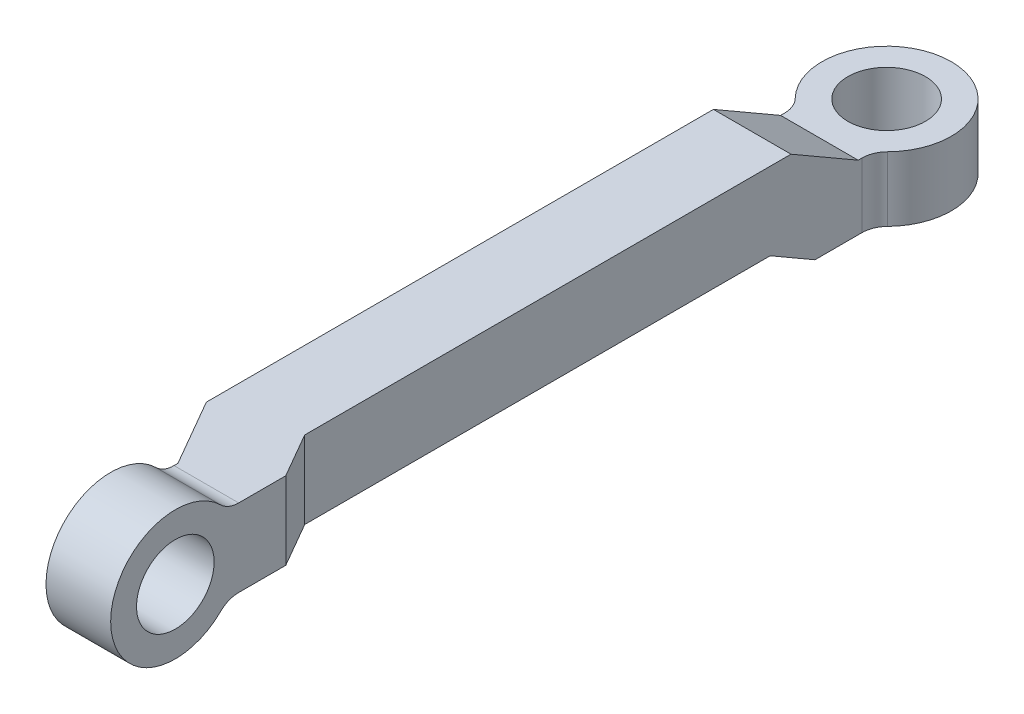
ISO-10303-21;
HEADER;
FILE_DESCRIPTION(('STEP AP214'),'2;1');
FILE_NAME('part.step','',(''),(''),'','','');
FILE_SCHEMA(('AUTOMOTIVE_DESIGN { 1 0 10303 214 1 1 1 1 }'));
ENDSEC;
DATA;
#1=APPLICATION_CONTEXT('core data for automotive mechanical design processes');
#2=APPLICATION_PROTOCOL_DEFINITION('international standard','automotive_design',2000,#1);
#3=PRODUCT_CONTEXT('',#1,'mechanical');
#4=PRODUCT('Part','Part','',(#3));
#5=PRODUCT_RELATED_PRODUCT_CATEGORY('part','',(#4));
#6=PRODUCT_DEFINITION_FORMATION('','',#4);
#7=PRODUCT_DEFINITION_CONTEXT('part definition',#1,'design');
#8=PRODUCT_DEFINITION('design','',#6,#7);
#9=PRODUCT_DEFINITION_SHAPE('','',#8);
#10=(LENGTH_UNIT() NAMED_UNIT(*) SI_UNIT(.MILLI.,.METRE.));
#11=(NAMED_UNIT(*) PLANE_ANGLE_UNIT() SI_UNIT($,.RADIAN.));
#12=(NAMED_UNIT(*) SI_UNIT($,.STERADIAN.) SOLID_ANGLE_UNIT());
#13=UNCERTAINTY_MEASURE_WITH_UNIT(LENGTH_MEASURE(1.E-05),#10,'distance_accuracy_value','');
#14=(GEOMETRIC_REPRESENTATION_CONTEXT(3) GLOBAL_UNCERTAINTY_ASSIGNED_CONTEXT((#13)) GLOBAL_UNIT_ASSIGNED_CONTEXT((#10,
#11,#12)) REPRESENTATION_CONTEXT('',''));
#15=CARTESIAN_POINT('',(0.,0.,0.));
#16=DIRECTION('',(0.,0.,1.));
#17=DIRECTION('',(1.,0.,0.));
#18=AXIS2_PLACEMENT_3D('',#15,#16,#17);
#19=CARTESIAN_POINT('',(-75.0000000000002,-125.01,-259.903810567666));
#20=DIRECTION('',(1.,0.,0.));
#21=DIRECTION('',(0.,0.,1.));
#22=AXIS2_PLACEMENT_3D('',#19,#20,#21);
#23=PLANE('',#22);
#24=DIRECTION('',(0.,0.,1.));
#25=VECTOR('',#24,1.);
#26=CARTESIAN_POINT('',(-75.0000000000002,-125.,0.));
#27=LINE('',#26,#25);
#28=CARTESIAN_POINT('',(-75.0000000000001,-125.,-1377.52551286084));
#29=VERTEX_POINT('',#28);
#30=CARTESIAN_POINT('',(-75.0000000000001,-125.,-1286.50635094611));
#31=VERTEX_POINT('',#30);
#32=EDGE_CURVE('E209',#29,#31,#27,.T.);
#33=ORIENTED_EDGE('',*,*,#32,.T.);
#34=DIRECTION('',(0.,0.500000000000001,0.866025403784438));
#35=VECTOR('',#34,1.);
#36=CARTESIAN_POINT('',(-75.0000000000002,463.323591024676,-267.500000000001));
#37=LINE('',#36,#35);
#38=CARTESIAN_POINT('',(-75.0000000000001,-75.,-1199.90381056767));
#39=VERTEX_POINT('',#38);
#40=EDGE_CURVE('E213',#31,#39,#37,.T.);
#41=ORIENTED_EDGE('',*,*,#40,.T.);
#42=DIRECTION('',(0.,0.,1.));
#43=VECTOR('',#42,1.);
#44=CARTESIAN_POINT('',(-75.0000000000002,-75.,0.));
#45=LINE('',#44,#43);
#46=CARTESIAN_POINT('',(-75.0000000000002,-75.,-259.903810567666));
#47=VERTEX_POINT('',#46);
#48=EDGE_CURVE('E216',#39,#47,#45,.T.);
#49=ORIENTED_EDGE('',*,*,#48,.T.);
#50=DIRECTION('',(0.,1.,0.));
#51=VECTOR('',#50,1.);
#52=CARTESIAN_POINT('',(-75.0000000000002,-125.01,-259.903810567666));
#53=LINE('',#52,#51);
#54=CARTESIAN_POINT('',(-75.0000000000002,75.,-259.903810567666));
#55=VERTEX_POINT('',#54);
#56=EDGE_CURVE('E236',#47,#55,#53,.T.);
#57=ORIENTED_EDGE('',*,*,#56,.T.);
#58=DIRECTION('',(0.,0.,1.));
#59=VECTOR('',#58,1.);
#60=CARTESIAN_POINT('',(-75.0000000000002,75.,0.));
#61=LINE('',#60,#59);
#62=CARTESIAN_POINT('',(-75.0000000000001,75.,-1240.09618943233));
#63=VERTEX_POINT('',#62);
#64=EDGE_CURVE('E231',#63,#55,#61,.T.);
#65=ORIENTED_EDGE('',*,*,#64,.F.);
#66=DIRECTION('',(0.,0.500000000000001,0.866025403784438));
#67=VECTOR('',#66,1.);
#68=CARTESIAN_POINT('',(-75.0000000000002,593.227401592341,-342.500000000001));
#69=LINE('',#68,#67);
#70=CARTESIAN_POINT('',(-75.0000000000001,0.,-1370.));
#71=VERTEX_POINT('',#70);
#72=EDGE_CURVE('E222',#71,#63,#69,.T.);
#73=ORIENTED_EDGE('',*,*,#72,.F.);
#74=DIRECTION('',(0.,0.,1.));
#75=VECTOR('',#74,1.);
#76=CARTESIAN_POINT('',(-75.0000000000002,0.,0.));
#77=LINE('',#76,#75);
#78=CARTESIAN_POINT('',(-75.0000000000001,0.,-1377.52551286084));
#79=VERTEX_POINT('',#78);
#80=EDGE_CURVE('E170',#79,#71,#77,.T.);
#81=ORIENTED_EDGE('',*,*,#80,.F.);
#82=DIRECTION('',(0.,-1.,0.));
#83=VECTOR('',#82,1.);
#84=CARTESIAN_POINT('',(-75.0000000000001,0.,-1377.52551286084));
#85=LINE('',#84,#83);
#86=EDGE_CURVE('E259',#29,#79,#85,.F.);
#87=ORIENTED_EDGE('',*,*,#86,.F.);
#88=EDGE_LOOP('',(#33,#41,#49,#57,#65,#73,#81,#87));
#89=FACE_BOUND('',#88,.T.);
#90=ADVANCED_FACE('F35',(#89),#23,.F.);
#91=CARTESIAN_POINT('',(0.,-125.01,-130.));
#92=DIRECTION('',(0.866025403784438,0.,-0.500000000000001));
#93=DIRECTION('',(0.500000000000001,0.,0.866025403784438));
#94=AXIS2_PLACEMENT_3D('',#91,#92,#93);
#95=PLANE('',#94);
#96=ORIENTED_EDGE('',*,*,#56,.F.);
#97=DIRECTION('',(0.500000000000001,0.,0.866025403784438));
#98=VECTOR('',#97,1.);
#99=CARTESIAN_POINT('',(25.0416512459885,-75.,-86.6265877365276));
#100=LINE('',#99,#98);
#101=CARTESIAN_POINT('',(0.,-75.,-130.));
#102=VERTEX_POINT('',#101);
#103=EDGE_CURVE('E173',#47,#102,#100,.T.);
#104=ORIENTED_EDGE('',*,*,#103,.T.);
#105=DIRECTION('',(0.,1.,0.));
#106=VECTOR('',#105,1.);
#107=CARTESIAN_POINT('',(0.,-125.01,-130.));
#108=LINE('',#107,#106);
#109=CARTESIAN_POINT('',(0.,75.,-130.));
#110=VERTEX_POINT('',#109);
#111=EDGE_CURVE('E163',#102,#110,#108,.T.);
#112=ORIENTED_EDGE('',*,*,#111,.T.);
#113=DIRECTION('',(0.500000000000001,0.,0.866025403784438));
#114=VECTOR('',#113,1.);
#115=CARTESIAN_POINT('',(25.0416512459885,75.,-86.6265877365276));
#116=LINE('',#115,#114);
#117=EDGE_CURVE('E228',#55,#110,#116,.T.);
#118=ORIENTED_EDGE('',*,*,#117,.F.);
#119=EDGE_LOOP('',(#96,#104,#112,#118));
#120=FACE_BOUND('',#119,.T.);
#121=ADVANCED_FACE('F326',(#120),#95,.F.);
#122=CARTESIAN_POINT('',(0.,-125.01,0.));
#123=DIRECTION('',(1.,0.,0.));
#124=DIRECTION('',(0.,0.,1.));
#125=AXIS2_PLACEMENT_3D('',#122,#123,#124);
#126=PLANE('',#125);
#127=ORIENTED_EDGE('',*,*,#111,.F.);
#128=DIRECTION('',(0.,0.,1.));
#129=VECTOR('',#128,1.);
#130=CARTESIAN_POINT('',(0.,-75.,0.));
#131=LINE('',#130,#129);
#132=CARTESIAN_POINT('',(0.,-75.,-122.474487139159));
#133=VERTEX_POINT('',#132);
#134=EDGE_CURVE('E169',#102,#133,#131,.T.);
#135=ORIENTED_EDGE('',*,*,#134,.T.);
#136=CARTESIAN_POINT('',(0.,-125.,-122.474487139159));
#137=DIRECTION('',(-1.,0.,0.));
#138=DIRECTION('',(0.,0.,1.));
#139=AXIS2_PLACEMENT_3D('',#136,#137,#138);
#140=CIRCLE('',#139,50.);
#141=CARTESIAN_POINT('',(0.,-89.2857142857143,-87.4817765279706));
#142=VERTEX_POINT('',#141);
#143=EDGE_CURVE('E281',#142,#133,#140,.T.);
#144=ORIENTED_EDGE('',*,*,#143,.F.);
#145=CARTESIAN_POINT('',(0.,0.,0.));
#146=DIRECTION('',(1.,0.,0.));
#147=DIRECTION('',(0.,0.,-1.));
#148=AXIS2_PLACEMENT_3D('',#145,#146,#147);
#149=CIRCLE('',#148,125.);
#150=CARTESIAN_POINT('',(0.,89.2857142857143,-87.4817765279706));
#151=VERTEX_POINT('',#150);
#152=EDGE_CURVE('E198',#151,#142,#149,.T.);
#153=ORIENTED_EDGE('',*,*,#152,.F.);
#154=CARTESIAN_POINT('',(0.,125.,-122.474487139159));
#155=DIRECTION('',(-1.,0.,0.));
#156=DIRECTION('',(0.,0.,1.));
#157=AXIS2_PLACEMENT_3D('',#154,#155,#156);
#158=CIRCLE('',#157,50.);
#159=CARTESIAN_POINT('',(0.,75.,-122.474487139159));
#160=VERTEX_POINT('',#159);
#161=EDGE_CURVE('E11',#160,#151,#158,.T.);
#162=ORIENTED_EDGE('',*,*,#161,.F.);
#163=DIRECTION('',(0.,0.,1.));
#164=VECTOR('',#163,1.);
#165=CARTESIAN_POINT('',(0.,75.,0.));
#166=LINE('',#165,#164);
#167=EDGE_CURVE('E226',#110,#160,#166,.T.);
#168=ORIENTED_EDGE('',*,*,#167,.F.);
#169=EDGE_LOOP('',(#127,#135,#144,#153,#162,#168));
#170=FACE_BOUND('',#169,.T.);
#171=CARTESIAN_POINT('',(0.,0.,0.));
#172=DIRECTION('',(1.,0.,0.));
#173=DIRECTION('',(0.,0.,-1.));
#174=AXIS2_PLACEMENT_3D('',#171,#172,#173);
#175=CIRCLE('',#174,75.);
#176=CARTESIAN_POINT('',(0.,0.,-75.));
#177=VERTEX_POINT('',#176);
#178=EDGE_CURVE('E194',#177,#177,#175,.T.);
#179=ORIENTED_EDGE('',*,*,#178,.T.);
#180=EDGE_LOOP('',(#179));
#181=FACE_BOUND('',#180,.T.);
#182=ADVANCED_FACE('F329',(#170,#181),#126,.F.);
#183=CARTESIAN_POINT('',(279.406285248044,-125.01,53.9458820036941));
#184=DIRECTION('',(-0.866025403784438,0.,0.500000000000001));
#185=DIRECTION('',(-0.500000000000001,0.,-0.866025403784438));
#186=AXIS2_PLACEMENT_3D('',#183,#184,#185);
#187=PLANE('',#186);
#188=DIRECTION('',(0.,-1.,0.));
#189=VECTOR('',#188,1.);
#190=CARTESIAN_POINT('',(125.,0.,-213.49364905389));
#191=LINE('',#190,#189);
#192=CARTESIAN_POINT('',(125.,75.,-213.49364905389));
#193=VERTEX_POINT('',#192);
#194=CARTESIAN_POINT('',(125.,-75.,-213.49364905389));
#195=VERTEX_POINT('',#194);
#196=EDGE_CURVE('E159',#193,#195,#191,.T.);
#197=ORIENTED_EDGE('',*,*,#196,.T.);
#198=DIRECTION('',(-0.500000000000001,0.,-0.866025403784438));
#199=VECTOR('',#198,1.);
#200=CARTESIAN_POINT('',(154.945461813654,-75.,-161.626587736528));
#201=LINE('',#200,#199);
#202=CARTESIAN_POINT('',(74.9999999999998,-75.,-300.096189432334));
#203=VERTEX_POINT('',#202);
#204=EDGE_CURVE('E180',#195,#203,#201,.T.);
#205=ORIENTED_EDGE('',*,*,#204,.T.);
#206=DIRECTION('',(0.,1.,0.));
#207=VECTOR('',#206,1.);
#208=CARTESIAN_POINT('',(74.9999999999998,-125.01,-300.096189432334));
#209=LINE('',#208,#207);
#210=CARTESIAN_POINT('',(74.9999999999998,75.,-300.096189432334));
#211=VERTEX_POINT('',#210);
#212=EDGE_CURVE('E161',#203,#211,#209,.T.);
#213=ORIENTED_EDGE('',*,*,#212,.T.);
#214=DIRECTION('',(-0.500000000000001,0.,-0.866025403784438));
#215=VECTOR('',#214,1.);
#216=CARTESIAN_POINT('',(154.945461813654,75.,-161.626587736528));
#217=LINE('',#216,#215);
#218=EDGE_CURVE('E148',#193,#211,#217,.T.);
#219=ORIENTED_EDGE('',*,*,#218,.F.);
#220=EDGE_LOOP('',(#197,#205,#213,#219));
#221=FACE_BOUND('',#220,.T.);
#222=ADVANCED_FACE('F157',(#221),#187,.F.);
#223=CARTESIAN_POINT('',(75.0000000000002,-125.01,-1400.));
#224=DIRECTION('',(-1.,0.,0.));
#225=DIRECTION('',(0.,0.,-1.));
#226=AXIS2_PLACEMENT_3D('',#223,#224,#225);
#227=PLANE('',#226);
#228=DIRECTION('',(0.,0.,-1.));
#229=VECTOR('',#228,1.);
#230=CARTESIAN_POINT('',(74.9999999999997,0.,0.));
#231=LINE('',#230,#229);
#232=CARTESIAN_POINT('',(75.0000000000002,0.,-1370.));
#233=VERTEX_POINT('',#232);
#234=CARTESIAN_POINT('',(75.0000000000002,0.,-1377.52551286084));
#235=VERTEX_POINT('',#234);
#236=EDGE_CURVE('E176',#233,#235,#231,.T.);
#237=ORIENTED_EDGE('',*,*,#236,.F.);
#238=DIRECTION('',(0.,-0.500000000000001,-0.866025403784438));
#239=VECTOR('',#238,1.);
#240=CARTESIAN_POINT('',(74.9999999999999,593.227401592341,-342.500000000001));
#241=LINE('',#240,#239);
#242=CARTESIAN_POINT('',(75.,75.,-1240.09618943233));
#243=VERTEX_POINT('',#242);
#244=EDGE_CURVE('E225',#243,#233,#241,.T.);
#245=ORIENTED_EDGE('',*,*,#244,.F.);
#246=DIRECTION('',(0.,0.,-1.));
#247=VECTOR('',#246,1.);
#248=CARTESIAN_POINT('',(74.9999999999997,75.,0.));
#249=LINE('',#248,#247);
#250=EDGE_CURVE('E162',#211,#243,#249,.T.);
#251=ORIENTED_EDGE('',*,*,#250,.F.);
#252=ORIENTED_EDGE('',*,*,#212,.F.);
#253=DIRECTION('',(0.,0.,-1.));
#254=VECTOR('',#253,1.);
#255=CARTESIAN_POINT('',(74.9999999999997,-75.,0.));
#256=LINE('',#255,#254);
#257=CARTESIAN_POINT('',(75.0000000000002,-75.,-1199.90381056767));
#258=VERTEX_POINT('',#257);
#259=EDGE_CURVE('E219',#203,#258,#256,.T.);
#260=ORIENTED_EDGE('',*,*,#259,.T.);
#261=DIRECTION('',(0.,-0.500000000000001,-0.866025403784438));
#262=VECTOR('',#261,1.);
#263=CARTESIAN_POINT('',(74.9999999999998,463.323591024676,-267.500000000001));
#264=LINE('',#263,#262);
#265=CARTESIAN_POINT('',(75.0000000000002,-125.,-1286.50635094611));
#266=VERTEX_POINT('',#265);
#267=EDGE_CURVE('E212',#258,#266,#264,.T.);
#268=ORIENTED_EDGE('',*,*,#267,.T.);
#269=DIRECTION('',(0.,0.,-1.));
#270=VECTOR('',#269,1.);
#271=CARTESIAN_POINT('',(74.9999999999997,-125.,0.));
#272=LINE('',#271,#270);
#273=CARTESIAN_POINT('',(75.0000000000002,-125.,-1377.52551286084));
#274=VERTEX_POINT('',#273);
#275=EDGE_CURVE('E190',#266,#274,#272,.T.);
#276=ORIENTED_EDGE('',*,*,#275,.T.);
#277=DIRECTION('',(0.,-1.,0.));
#278=VECTOR('',#277,1.);
#279=CARTESIAN_POINT('',(75.0000000000002,-125.,-1377.52551286084));
#280=LINE('',#279,#278);
#281=EDGE_CURVE('E256',#235,#274,#280,.T.);
#282=ORIENTED_EDGE('',*,*,#281,.F.);
#283=EDGE_LOOP('',(#237,#245,#251,#252,#260,#268,#276,#282));
#284=FACE_BOUND('',#283,.T.);
#285=ADVANCED_FACE('F302',(#284),#227,.F.);
#286=CARTESIAN_POINT('',(0.,-125.01,-1500.));
#287=DIRECTION('',(0.,1.,0.));
#288=DIRECTION('',(0.,0.,1.));
#289=AXIS2_PLACEMENT_3D('',#286,#287,#288);
#290=CYLINDRICAL_SURFACE('',#289,125.);
#291=CARTESIAN_POINT('',(0.,-125.,-1500.));
#292=DIRECTION('',(0.,-1.,0.));
#293=DIRECTION('',(0.,0.,1.));
#294=AXIS2_PLACEMENT_3D('',#291,#292,#293);
#295=CIRCLE('',#294,125.);
#296=CARTESIAN_POINT('',(89.2857142857144,-125.,-1412.51822347203));
#297=VERTEX_POINT('',#296);
#298=CARTESIAN_POINT('',(-89.2857142857144,-125.,-1412.51822347203));
#299=VERTEX_POINT('',#298);
#300=EDGE_CURVE('E189',#297,#299,#295,.F.);
#301=ORIENTED_EDGE('',*,*,#300,.T.);
#302=DIRECTION('',(0.,1.,0.));
#303=VECTOR('',#302,1.);
#304=CARTESIAN_POINT('',(-89.2857142857144,-125.01,-1412.51822347203));
#305=LINE('',#304,#303);
#306=CARTESIAN_POINT('',(-89.2857142857144,0.,-1412.51822347203));
#307=VERTEX_POINT('',#306);
#308=EDGE_CURVE('E206',#307,#299,#305,.F.);
#309=ORIENTED_EDGE('',*,*,#308,.F.);
#310=CARTESIAN_POINT('',(0.,0.,-1500.));
#311=DIRECTION('',(0.,-1.,0.));
#312=DIRECTION('',(0.,0.,1.));
#313=AXIS2_PLACEMENT_3D('',#310,#311,#312);
#314=CIRCLE('',#313,125.);
#315=CARTESIAN_POINT('',(89.2857142857144,0.,-1412.51822347203));
#316=VERTEX_POINT('',#315);
#317=EDGE_CURVE('E186',#307,#316,#314,.T.);
#318=ORIENTED_EDGE('',*,*,#317,.T.);
#319=DIRECTION('',(0.,1.,0.));
#320=VECTOR('',#319,1.);
#321=CARTESIAN_POINT('',(89.2857142857144,-125.01,-1412.51822347203));
#322=LINE('',#321,#320);
#323=EDGE_CURVE('E253',#297,#316,#322,.T.);
#324=ORIENTED_EDGE('',*,*,#323,.F.);
#325=EDGE_LOOP('',(#301,#309,#318,#324));
#326=FACE_BOUND('',#325,.T.);
#327=ADVANCED_FACE('F354',(#326),#290,.T.);
#328=CARTESIAN_POINT('',(125.,0.,0.));
#329=DIRECTION('',(-1.,0.,0.));
#330=DIRECTION('',(0.,0.,-1.));
#331=AXIS2_PLACEMENT_3D('',#328,#329,#330);
#332=CYLINDRICAL_SURFACE('',#331,75.);
#333=CARTESIAN_POINT('',(125.,0.,0.));
#334=DIRECTION('',(1.,0.,0.));
#335=DIRECTION('',(0.,0.,-1.));
#336=AXIS2_PLACEMENT_3D('',#333,#334,#335);
#337=CIRCLE('',#336,75.);
#338=CARTESIAN_POINT('',(125.,0.,-75.));
#339=VERTEX_POINT('',#338);
#340=EDGE_CURVE('E200',#339,#339,#337,.T.);
#341=ORIENTED_EDGE('',*,*,#340,.T.);
#342=EDGE_LOOP('',(#341));
#343=FACE_BOUND('',#342,.T.);
#344=ORIENTED_EDGE('',*,*,#178,.F.);
#345=EDGE_LOOP('',(#344));
#346=FACE_BOUND('',#345,.T.);
#347=ADVANCED_FACE('F344',(#343,#346),#332,.F.);
#348=CARTESIAN_POINT('',(-125.,-75.,0.));
#349=DIRECTION('',(0.,1.,0.));
#350=DIRECTION('',(0.,0.,1.));
#351=AXIS2_PLACEMENT_3D('',#348,#349,#350);
#352=PLANE('',#351);
#353=ORIENTED_EDGE('',*,*,#134,.F.);
#354=ORIENTED_EDGE('',*,*,#103,.F.);
#355=ORIENTED_EDGE('',*,*,#48,.F.);
#356=DIRECTION('',(1.,0.,0.));
#357=VECTOR('',#356,1.);
#358=CARTESIAN_POINT('',(-125.,-75.,-1199.90381056767));
#359=LINE('',#358,#357);
#360=EDGE_CURVE('E197',#39,#258,#359,.T.);
#361=ORIENTED_EDGE('',*,*,#360,.T.);
#362=ORIENTED_EDGE('',*,*,#259,.F.);
#363=ORIENTED_EDGE('',*,*,#204,.F.);
#364=DIRECTION('',(0.,0.,-1.));
#365=VECTOR('',#364,1.);
#366=CARTESIAN_POINT('',(125.,-75.,0.));
#367=LINE('',#366,#365);
#368=CARTESIAN_POINT('',(125.,-75.,-122.474487139159));
#369=VERTEX_POINT('',#368);
#370=EDGE_CURVE('E152',#369,#195,#367,.T.);
#371=ORIENTED_EDGE('',*,*,#370,.F.);
#372=DIRECTION('',(-1.,0.,0.));
#373=VECTOR('',#372,1.);
#374=CARTESIAN_POINT('',(-125.,-75.,-122.474487139159));
#375=LINE('',#374,#373);
#376=EDGE_CURVE('E262',#133,#369,#375,.F.);
#377=ORIENTED_EDGE('',*,*,#376,.F.);
#378=EDGE_LOOP('',(#353,#354,#355,#361,#362,#363,#371,#377));
#379=FACE_BOUND('',#378,.T.);
#380=ADVANCED_FACE('F292',(#379),#352,.F.);
#381=CARTESIAN_POINT('',(-125.,463.323591024676,-267.500000000001));
#382=DIRECTION('',(0.,0.866025403784438,-0.500000000000001));
#383=DIRECTION('',(0.,0.500000000000001,0.866025403784438));
#384=AXIS2_PLACEMENT_3D('',#381,#382,#383);
#385=PLANE('',#384);
#386=DIRECTION('',(1.,0.,0.));
#387=VECTOR('',#386,1.);
#388=CARTESIAN_POINT('',(-125.,-125.,-1286.50635094611));
#389=LINE('',#388,#387);
#390=EDGE_CURVE('E242',#31,#266,#389,.T.);
#391=ORIENTED_EDGE('',*,*,#390,.T.);
#392=ORIENTED_EDGE('',*,*,#267,.F.);
#393=ORIENTED_EDGE('',*,*,#360,.F.);
#394=ORIENTED_EDGE('',*,*,#40,.F.);
#395=EDGE_LOOP('',(#391,#392,#393,#394));
#396=FACE_BOUND('',#395,.T.);
#397=ADVANCED_FACE('F334',(#396),#385,.F.);
#398=CARTESIAN_POINT('',(0.,-125.,-1500.));
#399=DIRECTION('',(0.,1.,0.));
#400=DIRECTION('',(0.,0.,1.));
#401=AXIS2_PLACEMENT_3D('',#398,#399,#400);
#402=CYLINDRICAL_SURFACE('',#401,75.);
#403=CARTESIAN_POINT('',(0.,0.,-1500.));
#404=DIRECTION('',(0.,-1.,0.));
#405=DIRECTION('',(0.,0.,1.));
#406=AXIS2_PLACEMENT_3D('',#403,#404,#405);
#407=CIRCLE('',#406,75.);
#408=CARTESIAN_POINT('',(0.,0.,-1425.));
#409=VERTEX_POINT('',#408);
#410=EDGE_CURVE('E182',#409,#409,#407,.T.);
#411=ORIENTED_EDGE('',*,*,#410,.F.);
#412=EDGE_LOOP('',(#411));
#413=FACE_BOUND('',#412,.T.);
#414=CARTESIAN_POINT('',(0.,-125.,-1500.));
#415=DIRECTION('',(0.,-1.,0.));
#416=DIRECTION('',(0.,0.,1.));
#417=AXIS2_PLACEMENT_3D('',#414,#415,#416);
#418=CIRCLE('',#417,75.);
#419=CARTESIAN_POINT('',(0.,-125.,-1425.));
#420=VERTEX_POINT('',#419);
#421=EDGE_CURVE('E185',#420,#420,#418,.T.);
#422=ORIENTED_EDGE('',*,*,#421,.T.);
#423=EDGE_LOOP('',(#422));
#424=FACE_BOUND('',#423,.T.);
#425=ADVANCED_FACE('F336',(#413,#424),#402,.F.);
#426=CARTESIAN_POINT('',(-125.,0.,0.));
#427=DIRECTION('',(0.,1.,0.));
#428=DIRECTION('',(0.,0.,1.));
#429=AXIS2_PLACEMENT_3D('',#426,#427,#428);
#430=PLANE('',#429);
#431=ORIENTED_EDGE('',*,*,#80,.T.);
#432=DIRECTION('',(1.,0.,0.));
#433=VECTOR('',#432,1.);
#434=CARTESIAN_POINT('',(-125.,0.,-1370.));
#435=LINE('',#434,#433);
#436=EDGE_CURVE('E240',#71,#233,#435,.T.);
#437=ORIENTED_EDGE('',*,*,#436,.T.);
#438=ORIENTED_EDGE('',*,*,#236,.T.);
#439=CARTESIAN_POINT('',(125.,0.,-1377.52551286084));
#440=DIRECTION('',(0.,-1.,0.));
#441=DIRECTION('',(0.,0.,1.));
#442=AXIS2_PLACEMENT_3D('',#439,#440,#441);
#443=CIRCLE('',#442,50.);
#444=EDGE_CURVE('E271',#316,#235,#443,.F.);
#445=ORIENTED_EDGE('',*,*,#444,.F.);
#446=ORIENTED_EDGE('',*,*,#317,.F.);
#447=CARTESIAN_POINT('',(-125.,0.,-1377.52551286084));
#448=DIRECTION('',(0.,-1.,0.));
#449=DIRECTION('',(0.,0.,1.));
#450=AXIS2_PLACEMENT_3D('',#447,#448,#449);
#451=CIRCLE('',#450,50.);
#452=EDGE_CURVE('E275',#79,#307,#451,.F.);
#453=ORIENTED_EDGE('',*,*,#452,.F.);
#454=EDGE_LOOP('',(#431,#437,#438,#445,#446,#453));
#455=FACE_BOUND('',#454,.T.);
#456=ORIENTED_EDGE('',*,*,#410,.T.);
#457=EDGE_LOOP('',(#456));
#458=FACE_BOUND('',#457,.T.);
#459=ADVANCED_FACE('F314',(#455,#458),#430,.T.);
#460=CARTESIAN_POINT('',(125.,0.,0.));
#461=DIRECTION('',(-1.,0.,0.));
#462=DIRECTION('',(0.,0.,-1.));
#463=AXIS2_PLACEMENT_3D('',#460,#461,#462);
#464=CYLINDRICAL_SURFACE('',#463,125.);
#465=CARTESIAN_POINT('',(125.,0.,0.));
#466=DIRECTION('',(1.,0.,0.));
#467=DIRECTION('',(0.,0.,-1.));
#468=AXIS2_PLACEMENT_3D('',#465,#466,#467);
#469=CIRCLE('',#468,125.);
#470=CARTESIAN_POINT('',(125.,89.2857142857143,-87.4817765279706));
#471=VERTEX_POINT('',#470);
#472=CARTESIAN_POINT('',(125.,-89.2857142857143,-87.4817765279706));
#473=VERTEX_POINT('',#472);
#474=EDGE_CURVE('E193',#471,#473,#469,.T.);
#475=ORIENTED_EDGE('',*,*,#474,.F.);
#476=DIRECTION('',(-1.,0.,0.));
#477=VECTOR('',#476,1.);
#478=CARTESIAN_POINT('',(125.,89.2857142857143,-87.4817765279706));
#479=LINE('',#478,#477);
#480=EDGE_CURVE('E265',#151,#471,#479,.F.);
#481=ORIENTED_EDGE('',*,*,#480,.F.);
#482=ORIENTED_EDGE('',*,*,#152,.T.);
#483=DIRECTION('',(-1.,0.,0.));
#484=VECTOR('',#483,1.);
#485=CARTESIAN_POINT('',(125.,-89.2857142857143,-87.4817765279706));
#486=LINE('',#485,#484);
#487=EDGE_CURVE('E268',#473,#142,#486,.T.);
#488=ORIENTED_EDGE('',*,*,#487,.F.);
#489=EDGE_LOOP('',(#475,#481,#482,#488));
#490=FACE_BOUND('',#489,.T.);
#491=ADVANCED_FACE('F286',(#490),#464,.T.);
#492=CARTESIAN_POINT('',(125.,0.,0.));
#493=DIRECTION('',(-1.,0.,0.));
#494=DIRECTION('',(0.,0.,-1.));
#495=AXIS2_PLACEMENT_3D('',#492,#493,#494);
#496=PLANE('',#495);
#497=ORIENTED_EDGE('',*,*,#340,.F.);
#498=EDGE_LOOP('',(#497));
#499=FACE_BOUND('',#498,.T.);
#500=ORIENTED_EDGE('',*,*,#474,.T.);
#501=CARTESIAN_POINT('',(125.,-125.,-122.474487139159));
#502=DIRECTION('',(1.,0.,0.));
#503=DIRECTION('',(0.,0.,-1.));
#504=AXIS2_PLACEMENT_3D('',#501,#502,#503);
#505=CIRCLE('',#504,50.);
#506=EDGE_CURVE('E279',#369,#473,#505,.T.);
#507=ORIENTED_EDGE('',*,*,#506,.F.);
#508=ORIENTED_EDGE('',*,*,#370,.T.);
#509=ORIENTED_EDGE('',*,*,#196,.F.);
#510=DIRECTION('',(0.,0.,-1.));
#511=VECTOR('',#510,1.);
#512=CARTESIAN_POINT('',(125.,75.,0.));
#513=LINE('',#512,#511);
#514=CARTESIAN_POINT('',(125.,75.,-122.474487139159));
#515=VERTEX_POINT('',#514);
#516=EDGE_CURVE('E144',#515,#193,#513,.T.);
#517=ORIENTED_EDGE('',*,*,#516,.F.);
#518=CARTESIAN_POINT('',(125.,125.,-122.474487139159));
#519=DIRECTION('',(1.,0.,0.));
#520=DIRECTION('',(0.,0.,-1.));
#521=AXIS2_PLACEMENT_3D('',#518,#519,#520);
#522=CIRCLE('',#521,50.);
#523=EDGE_CURVE('E43',#471,#515,#522,.T.);
#524=ORIENTED_EDGE('',*,*,#523,.F.);
#525=EDGE_LOOP('',(#500,#507,#508,#509,#517,#524));
#526=FACE_BOUND('',#525,.T.);
#527=ADVANCED_FACE('F166',(#499,#526),#496,.F.);
#528=CARTESIAN_POINT('',(-125.,593.227401592341,-342.500000000001));
#529=DIRECTION('',(0.,0.866025403784438,-0.500000000000001));
#530=DIRECTION('',(0.,0.500000000000001,0.866025403784438));
#531=AXIS2_PLACEMENT_3D('',#528,#529,#530);
#532=PLANE('',#531);
#533=ORIENTED_EDGE('',*,*,#72,.T.);
#534=DIRECTION('',(1.,0.,0.));
#535=VECTOR('',#534,1.);
#536=CARTESIAN_POINT('',(-125.,75.,-1240.09618943233));
#537=LINE('',#536,#535);
#538=EDGE_CURVE('E153',#63,#243,#537,.T.);
#539=ORIENTED_EDGE('',*,*,#538,.T.);
#540=ORIENTED_EDGE('',*,*,#244,.T.);
#541=ORIENTED_EDGE('',*,*,#436,.F.);
#542=EDGE_LOOP('',(#533,#539,#540,#541));
#543=FACE_BOUND('',#542,.T.);
#544=ADVANCED_FACE('F319',(#543),#532,.T.);
#545=CARTESIAN_POINT('',(-125.,75.,0.));
#546=DIRECTION('',(0.,1.,0.));
#547=DIRECTION('',(0.,0.,1.));
#548=AXIS2_PLACEMENT_3D('',#545,#546,#547);
#549=PLANE('',#548);
#550=ORIENTED_EDGE('',*,*,#516,.T.);
#551=ORIENTED_EDGE('',*,*,#218,.T.);
#552=ORIENTED_EDGE('',*,*,#250,.T.);
#553=ORIENTED_EDGE('',*,*,#538,.F.);
#554=ORIENTED_EDGE('',*,*,#64,.T.);
#555=ORIENTED_EDGE('',*,*,#117,.T.);
#556=ORIENTED_EDGE('',*,*,#167,.T.);
#557=DIRECTION('',(1.,0.,0.));
#558=VECTOR('',#557,1.);
#559=CARTESIAN_POINT('',(0.,75.,-122.474487139159));
#560=LINE('',#559,#558);
#561=EDGE_CURVE('E50',#515,#160,#560,.F.);
#562=ORIENTED_EDGE('',*,*,#561,.F.);
#563=EDGE_LOOP('',(#550,#551,#552,#553,#554,#555,#556,#562));
#564=FACE_BOUND('',#563,.T.);
#565=ADVANCED_FACE('F146',(#564),#549,.T.);
#566=CARTESIAN_POINT('',(-125.,-125.,0.));
#567=DIRECTION('',(0.,1.,0.));
#568=DIRECTION('',(0.,0.,1.));
#569=AXIS2_PLACEMENT_3D('',#566,#567,#568);
#570=PLANE('',#569);
#571=ORIENTED_EDGE('',*,*,#421,.F.);
#572=EDGE_LOOP('',(#571));
#573=FACE_BOUND('',#572,.T.);
#574=ORIENTED_EDGE('',*,*,#275,.F.);
#575=ORIENTED_EDGE('',*,*,#390,.F.);
#576=ORIENTED_EDGE('',*,*,#32,.F.);
#577=CARTESIAN_POINT('',(-125.,-125.,-1377.52551286084));
#578=DIRECTION('',(0.,-1.,0.));
#579=DIRECTION('',(0.,0.,1.));
#580=AXIS2_PLACEMENT_3D('',#577,#578,#579);
#581=CIRCLE('',#580,50.);
#582=EDGE_CURVE('E277',#299,#29,#581,.T.);
#583=ORIENTED_EDGE('',*,*,#582,.F.);
#584=ORIENTED_EDGE('',*,*,#300,.F.);
#585=CARTESIAN_POINT('',(125.,-125.,-1377.52551286084));
#586=DIRECTION('',(0.,-1.,0.));
#587=DIRECTION('',(0.,0.,1.));
#588=AXIS2_PLACEMENT_3D('',#585,#586,#587);
#589=CIRCLE('',#588,50.);
#590=EDGE_CURVE('E273',#274,#297,#589,.T.);
#591=ORIENTED_EDGE('',*,*,#590,.F.);
#592=EDGE_LOOP('',(#574,#575,#576,#583,#584,#591));
#593=FACE_BOUND('',#592,.T.);
#594=ADVANCED_FACE('F305',(#573,#593),#570,.F.);
#595=CARTESIAN_POINT('',(125.,-125.01,-1377.52551286084));
#596=DIRECTION('',(0.,1.,0.));
#597=DIRECTION('',(0.,0.,1.));
#598=AXIS2_PLACEMENT_3D('',#595,#596,#597);
#599=CYLINDRICAL_SURFACE('',#598,50.);
#600=ORIENTED_EDGE('',*,*,#590,.T.);
#601=ORIENTED_EDGE('',*,*,#323,.T.);
#602=ORIENTED_EDGE('',*,*,#444,.T.);
#603=ORIENTED_EDGE('',*,*,#281,.T.);
#604=EDGE_LOOP('',(#600,#601,#602,#603));
#605=FACE_BOUND('',#604,.T.);
#606=ADVANCED_FACE('F311',(#605),#599,.F.);
#607=CARTESIAN_POINT('',(-125.,-125.01,-1377.52551286084));
#608=DIRECTION('',(0.,1.,0.));
#609=DIRECTION('',(0.,0.,1.));
#610=AXIS2_PLACEMENT_3D('',#607,#608,#609);
#611=CYLINDRICAL_SURFACE('',#610,50.);
#612=ORIENTED_EDGE('',*,*,#582,.T.);
#613=ORIENTED_EDGE('',*,*,#86,.T.);
#614=ORIENTED_EDGE('',*,*,#452,.T.);
#615=ORIENTED_EDGE('',*,*,#308,.T.);
#616=EDGE_LOOP('',(#612,#613,#614,#615));
#617=FACE_BOUND('',#616,.T.);
#618=ADVANCED_FACE('F391',(#617),#611,.F.);
#619=CARTESIAN_POINT('',(125.,-125.,-122.474487139159));
#620=DIRECTION('',(-1.,0.,0.));
#621=DIRECTION('',(0.,0.,-1.));
#622=AXIS2_PLACEMENT_3D('',#619,#620,#621);
#623=CYLINDRICAL_SURFACE('',#622,50.);
#624=ORIENTED_EDGE('',*,*,#143,.T.);
#625=ORIENTED_EDGE('',*,*,#376,.T.);
#626=ORIENTED_EDGE('',*,*,#506,.T.);
#627=ORIENTED_EDGE('',*,*,#487,.T.);
#628=EDGE_LOOP('',(#624,#625,#626,#627));
#629=FACE_BOUND('',#628,.T.);
#630=ADVANCED_FACE('F290',(#629),#623,.F.);
#631=CARTESIAN_POINT('',(125.,125.,-122.474487139159));
#632=DIRECTION('',(-1.,0.,0.));
#633=DIRECTION('',(0.,0.,-1.));
#634=AXIS2_PLACEMENT_3D('',#631,#632,#633);
#635=CYLINDRICAL_SURFACE('',#634,50.);
#636=ORIENTED_EDGE('',*,*,#161,.T.);
#637=ORIENTED_EDGE('',*,*,#480,.T.);
#638=ORIENTED_EDGE('',*,*,#523,.T.);
#639=ORIENTED_EDGE('',*,*,#561,.T.);
#640=EDGE_LOOP('',(#636,#637,#638,#639));
#641=FACE_BOUND('',#640,.T.);
#642=ADVANCED_FACE('F37',(#641),#635,.F.);
#643=CLOSED_SHELL('',(#90,#121,#182,#222,#285,#327,#347,#380,#397,#425,#459,#491,#527,#544,#565,
#594,#606,#618,#630,#642));
#644=MANIFOLD_SOLID_BREP('B2',#643);
#645=ADVANCED_BREP_SHAPE_REPRESENTATION('',(#18,#644),#14);
#646=SHAPE_DEFINITION_REPRESENTATION(#9,#645);
ENDSEC;
END-ISO-10303-21;
